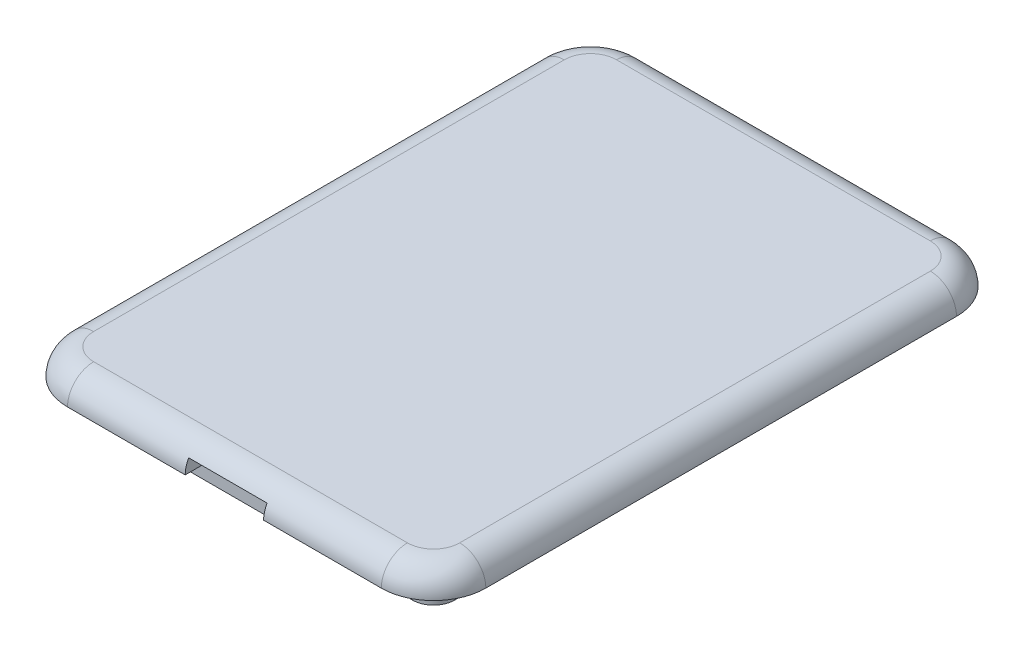
ISO-10303-21;
HEADER;
FILE_DESCRIPTION(('STEP AP214'),'2;1');
FILE_NAME('part.step','',(''),(''),'','','');
FILE_SCHEMA(('AUTOMOTIVE_DESIGN { 1 0 10303 214 1 1 1 1 }'));
ENDSEC;
DATA;
#1=APPLICATION_CONTEXT('core data for automotive mechanical design processes');
#2=APPLICATION_PROTOCOL_DEFINITION('international standard','automotive_design',2000,#1);
#3=PRODUCT_CONTEXT('',#1,'mechanical');
#4=PRODUCT('Part','Part','',(#3));
#5=PRODUCT_RELATED_PRODUCT_CATEGORY('part','',(#4));
#6=PRODUCT_DEFINITION_FORMATION('','',#4);
#7=PRODUCT_DEFINITION_CONTEXT('part definition',#1,'design');
#8=PRODUCT_DEFINITION('design','',#6,#7);
#9=PRODUCT_DEFINITION_SHAPE('','',#8);
#10=(LENGTH_UNIT() NAMED_UNIT(*) SI_UNIT(.MILLI.,.METRE.));
#11=(NAMED_UNIT(*) PLANE_ANGLE_UNIT() SI_UNIT($,.RADIAN.));
#12=(NAMED_UNIT(*) SI_UNIT($,.STERADIAN.) SOLID_ANGLE_UNIT());
#13=UNCERTAINTY_MEASURE_WITH_UNIT(LENGTH_MEASURE(1.E-05),#10,'distance_accuracy_value','');
#14=(GEOMETRIC_REPRESENTATION_CONTEXT(3) GLOBAL_UNCERTAINTY_ASSIGNED_CONTEXT((#13)) GLOBAL_UNIT_ASSIGNED_CONTEXT((#10,
#11,#12)) REPRESENTATION_CONTEXT('',''));
#15=CARTESIAN_POINT('',(0.,0.,0.));
#16=DIRECTION('',(0.,0.,1.));
#17=DIRECTION('',(1.,0.,0.));
#18=AXIS2_PLACEMENT_3D('',#15,#16,#17);
#19=CARTESIAN_POINT('',(-40.1594594594594,0.,-52.3807254623044));
#20=DIRECTION('',(0.,1.,0.));
#21=DIRECTION('',(0.,0.,1.));
#22=AXIS2_PLACEMENT_3D('',#19,#20,#21);
#23=PLANE('',#22);
#24=DIRECTION('',(1.,0.,0.));
#25=VECTOR('',#24,1.);
#26=CARTESIAN_POINT('',(0.,0.,-57.4607254623044));
#27=LINE('',#26,#25);
#28=CARTESIAN_POINT('',(-40.1594594594594,0.,-57.4607254623044));
#29=VERTEX_POINT('',#28);
#30=CARTESIAN_POINT('',(36.0405405405406,0.,-57.4607254623044));
#31=VERTEX_POINT('',#30);
#32=EDGE_CURVE('E328',#29,#31,#27,.T.);
#33=ORIENTED_EDGE('',*,*,#32,.F.);
#34=CARTESIAN_POINT('',(-40.1594594594594,0.,-52.3807254623044));
#35=DIRECTION('',(0.,1.,0.));
#36=DIRECTION('',(0.,0.,1.));
#37=AXIS2_PLACEMENT_3D('',#34,#35,#36);
#38=CIRCLE('',#37,5.07999999999999);
#39=CARTESIAN_POINT('',(-45.2394594594594,0.,-52.3807254623044));
#40=VERTEX_POINT('',#39);
#41=EDGE_CURVE('E332',#29,#40,#38,.T.);
#42=ORIENTED_EDGE('',*,*,#41,.T.);
#43=DIRECTION('',(0.,0.,1.));
#44=VECTOR('',#43,1.);
#45=CARTESIAN_POINT('',(-45.2394594594594,0.,0.));
#46=LINE('',#45,#44);
#47=CARTESIAN_POINT('',(-45.2394594594594,0.,61.9192745376956));
#48=VERTEX_POINT('',#47);
#49=EDGE_CURVE('E335',#40,#48,#46,.T.);
#50=ORIENTED_EDGE('',*,*,#49,.T.);
#51=CARTESIAN_POINT('',(-40.1594594594594,0.,61.9192745376956));
#52=DIRECTION('',(0.,1.,0.));
#53=DIRECTION('',(0.,0.,1.));
#54=AXIS2_PLACEMENT_3D('',#51,#52,#53);
#55=CIRCLE('',#54,5.07999999999999);
#56=CARTESIAN_POINT('',(-40.1594594594594,0.,66.9992745376956));
#57=VERTEX_POINT('',#56);
#58=EDGE_CURVE('E338',#48,#57,#55,.T.);
#59=ORIENTED_EDGE('',*,*,#58,.T.);
#60=DIRECTION('',(1.,0.,0.));
#61=VECTOR('',#60,1.);
#62=CARTESIAN_POINT('',(0.,0.,66.9992745376956));
#63=LINE('',#62,#61);
#64=CARTESIAN_POINT('',(36.0405405405406,0.,66.9992745376956));
#65=VERTEX_POINT('',#64);
#66=EDGE_CURVE('E341',#57,#65,#63,.T.);
#67=ORIENTED_EDGE('',*,*,#66,.T.);
#68=CARTESIAN_POINT('',(36.0405405405406,0.,61.9192745376956));
#69=DIRECTION('',(0.,1.,0.));
#70=DIRECTION('',(0.,0.,1.));
#71=AXIS2_PLACEMENT_3D('',#68,#69,#70);
#72=CIRCLE('',#71,5.08);
#73=CARTESIAN_POINT('',(41.1205405405406,0.,61.9192745376956));
#74=VERTEX_POINT('',#73);
#75=EDGE_CURVE('E344',#65,#74,#72,.T.);
#76=ORIENTED_EDGE('',*,*,#75,.T.);
#77=DIRECTION('',(0.,0.,1.));
#78=VECTOR('',#77,1.);
#79=CARTESIAN_POINT('',(41.1205405405406,0.,0.));
#80=LINE('',#79,#78);
#81=CARTESIAN_POINT('',(41.1205405405405,0.,-52.3807254623044));
#82=VERTEX_POINT('',#81);
#83=EDGE_CURVE('E347',#82,#74,#80,.T.);
#84=ORIENTED_EDGE('',*,*,#83,.F.);
#85=CARTESIAN_POINT('',(36.0405405405405,0.,-52.3807254623044));
#86=DIRECTION('',(0.,1.,0.));
#87=DIRECTION('',(0.,0.,1.));
#88=AXIS2_PLACEMENT_3D('',#85,#86,#87);
#89=CIRCLE('',#88,5.08000000000001);
#90=EDGE_CURVE('E273',#31,#82,#89,.F.);
#91=ORIENTED_EDGE('',*,*,#90,.F.);
#92=EDGE_LOOP('',(#33,#42,#50,#59,#67,#76,#84,#91));
#93=FACE_BOUND('',#92,.T.);
#94=DIRECTION('',(0.,0.,1.));
#95=VECTOR('',#94,1.);
#96=CARTESIAN_POINT('',(7.46554054054056,0.,-52.3807254623044));
#97=LINE('',#96,#95);
#98=CARTESIAN_POINT('',(7.46554054054057,0.,68.2692745376956));
#99=VERTEX_POINT('',#98);
#100=CARTESIAN_POINT('',(7.46554054054057,0.,74.6192745376956));
#101=VERTEX_POINT('',#100);
#102=EDGE_CURVE('E228',#99,#101,#97,.T.);
#103=ORIENTED_EDGE('',*,*,#102,.F.);
#104=DIRECTION('',(-1.,0.,0.));
#105=VECTOR('',#104,1.);
#106=CARTESIAN_POINT('',(-40.1594594594594,0.,68.2692745376956));
#107=LINE('',#106,#105);
#108=CARTESIAN_POINT('',(-11.5844594594594,0.,68.2692745376956));
#109=VERTEX_POINT('',#108);
#110=EDGE_CURVE('E11',#99,#109,#107,.T.);
#111=ORIENTED_EDGE('',*,*,#110,.T.);
#112=DIRECTION('',(0.,0.,1.));
#113=VECTOR('',#112,1.);
#114=CARTESIAN_POINT('',(-11.5844594594594,0.,-52.3807254623044));
#115=LINE('',#114,#113);
#116=CARTESIAN_POINT('',(-11.5844594594594,0.,74.6192745376956));
#117=VERTEX_POINT('',#116);
#118=EDGE_CURVE('E223',#109,#117,#115,.T.);
#119=ORIENTED_EDGE('',*,*,#118,.T.);
#120=DIRECTION('',(1.,0.,0.));
#121=VECTOR('',#120,1.);
#122=CARTESIAN_POINT('',(-40.1594594594594,0.,74.6192745376956));
#123=LINE('',#122,#121);
#124=CARTESIAN_POINT('',(-40.1594594594594,0.,74.6192745376956));
#125=VERTEX_POINT('',#124);
#126=EDGE_CURVE('E250',#125,#117,#123,.T.);
#127=ORIENTED_EDGE('',*,*,#126,.F.);
#128=CARTESIAN_POINT('',(-40.1594594594594,0.,61.9192745376956));
#129=DIRECTION('',(0.,1.,0.));
#130=DIRECTION('',(0.,0.,1.));
#131=AXIS2_PLACEMENT_3D('',#128,#129,#130);
#132=CIRCLE('',#131,12.7);
#133=CARTESIAN_POINT('',(-52.8594594594594,0.,61.9192745376955));
#134=VERTEX_POINT('',#133);
#135=EDGE_CURVE('E245',#134,#125,#132,.T.);
#136=ORIENTED_EDGE('',*,*,#135,.F.);
#137=DIRECTION('',(0.,0.,1.));
#138=VECTOR('',#137,1.);
#139=CARTESIAN_POINT('',(-52.8594594594594,0.,-52.3807254623043));
#140=LINE('',#139,#138);
#141=CARTESIAN_POINT('',(-52.8594594594594,0.,-52.3807254623043));
#142=VERTEX_POINT('',#141);
#143=EDGE_CURVE('E240',#142,#134,#140,.T.);
#144=ORIENTED_EDGE('',*,*,#143,.F.);
#145=CARTESIAN_POINT('',(-40.1594594594594,0.,-52.3807254623044));
#146=DIRECTION('',(0.,1.,0.));
#147=DIRECTION('',(0.,0.,1.));
#148=AXIS2_PLACEMENT_3D('',#145,#146,#147);
#149=CIRCLE('',#148,12.7);
#150=CARTESIAN_POINT('',(-40.1594594594594,0.,-65.0807254623044));
#151=VERTEX_POINT('',#150);
#152=EDGE_CURVE('E236',#151,#142,#149,.T.);
#153=ORIENTED_EDGE('',*,*,#152,.F.);
#154=DIRECTION('',(1.,0.,0.));
#155=VECTOR('',#154,1.);
#156=CARTESIAN_POINT('',(-40.1594594594594,0.,-65.0807254623044));
#157=LINE('',#156,#155);
#158=CARTESIAN_POINT('',(36.0405405405404,0.,-65.0807254623044));
#159=VERTEX_POINT('',#158);
#160=EDGE_CURVE('E264',#151,#159,#157,.T.);
#161=ORIENTED_EDGE('',*,*,#160,.T.);
#162=CARTESIAN_POINT('',(36.0405405405405,0.,-52.3807254623044));
#163=DIRECTION('',(0.,-1.,0.));
#164=DIRECTION('',(0.,0.,-1.));
#165=AXIS2_PLACEMENT_3D('',#162,#163,#164);
#166=CIRCLE('',#165,12.7);
#167=CARTESIAN_POINT('',(48.7405405405405,0.,-52.3807254623043));
#168=VERTEX_POINT('',#167);
#169=EDGE_CURVE('E261',#159,#168,#166,.T.);
#170=ORIENTED_EDGE('',*,*,#169,.T.);
#171=DIRECTION('',(0.,0.,1.));
#172=VECTOR('',#171,1.);
#173=CARTESIAN_POINT('',(48.7405405405405,0.,-52.3807254623043));
#174=LINE('',#173,#172);
#175=CARTESIAN_POINT('',(48.7405405405406,0.,61.9192745376955));
#176=VERTEX_POINT('',#175);
#177=EDGE_CURVE('E258',#168,#176,#174,.T.);
#178=ORIENTED_EDGE('',*,*,#177,.T.);
#179=CARTESIAN_POINT('',(36.0405405405406,0.,61.9192745376956));
#180=DIRECTION('',(0.,1.,0.));
#181=DIRECTION('',(0.,0.,1.));
#182=AXIS2_PLACEMENT_3D('',#179,#180,#181);
#183=CIRCLE('',#182,12.7);
#184=CARTESIAN_POINT('',(36.0405405405405,0.,74.6192745376956));
#185=VERTEX_POINT('',#184);
#186=EDGE_CURVE('E254',#185,#176,#183,.T.);
#187=ORIENTED_EDGE('',*,*,#186,.F.);
#188=EDGE_CURVE('E249',#101,#185,#123,.T.);
#189=ORIENTED_EDGE('',*,*,#188,.F.);
#190=EDGE_LOOP('',(#103,#111,#119,#127,#136,#144,#153,#161,#170,#178,#187,#189));
#191=FACE_BOUND('',#190,.T.);
#192=ADVANCED_FACE('F39',(#93,#191),#23,.F.);
#193=CARTESIAN_POINT('',(-40.1594594594594,0.,68.2692745376956));
#194=DIRECTION('',(-1.,0.,0.));
#195=DIRECTION('',(0.,0.,1.));
#196=AXIS2_PLACEMENT_3D('',#193,#194,#195);
#197=CYLINDRICAL_SURFACE('',#196,6.35);
#198=DIRECTION('',(-1.,0.,0.));
#199=VECTOR('',#198,1.);
#200=CARTESIAN_POINT('',(-40.1594594594594,3.175,73.7685358517268));
#201=LINE('',#200,#199);
#202=CARTESIAN_POINT('',(-11.5844594594594,3.175,73.7685358517268));
#203=VERTEX_POINT('',#202);
#204=CARTESIAN_POINT('',(7.46554054054056,3.175,73.7685358517268));
#205=VERTEX_POINT('',#204);
#206=EDGE_CURVE('E455',#203,#205,#201,.F.);
#207=ORIENTED_EDGE('',*,*,#206,.T.);
#208=CARTESIAN_POINT('',(7.46554054054056,0.,68.2692745376956));
#209=DIRECTION('',(-1.,0.,0.));
#210=DIRECTION('',(0.,-1.,0.));
#211=AXIS2_PLACEMENT_3D('',#208,#209,#210);
#212=CIRCLE('',#211,6.35);
#213=EDGE_CURVE('E48',#205,#101,#212,.F.);
#214=ORIENTED_EDGE('',*,*,#213,.T.);
#215=ORIENTED_EDGE('',*,*,#188,.T.);
#216=CARTESIAN_POINT('',(36.0405405405405,0.,68.2692745376956));
#217=DIRECTION('',(-1.,0.,0.));
#218=DIRECTION('',(0.,0.,1.));
#219=AXIS2_PLACEMENT_3D('',#216,#217,#218);
#220=CIRCLE('',#219,6.35);
#221=CARTESIAN_POINT('',(36.0405405405405,6.35,68.2692745376956));
#222=VERTEX_POINT('',#221);
#223=EDGE_CURVE('E446',#185,#222,#220,.T.);
#224=ORIENTED_EDGE('',*,*,#223,.T.);
#225=DIRECTION('',(1.,0.,0.));
#226=VECTOR('',#225,1.);
#227=CARTESIAN_POINT('',(36.0405405405405,6.35,68.2692745376956));
#228=LINE('',#227,#226);
#229=CARTESIAN_POINT('',(-40.1594594594594,6.35,68.2692745376956));
#230=VERTEX_POINT('',#229);
#231=EDGE_CURVE('E407',#230,#222,#228,.T.);
#232=ORIENTED_EDGE('',*,*,#231,.F.);
#233=CARTESIAN_POINT('',(-40.1594594594594,0.,68.2692745376956));
#234=DIRECTION('',(-1.,0.,0.));
#235=DIRECTION('',(0.,0.,1.));
#236=AXIS2_PLACEMENT_3D('',#233,#234,#235);
#237=CIRCLE('',#236,6.35);
#238=EDGE_CURVE('E438',#125,#230,#237,.T.);
#239=ORIENTED_EDGE('',*,*,#238,.F.);
#240=ORIENTED_EDGE('',*,*,#126,.T.);
#241=CARTESIAN_POINT('',(-11.5844594594594,0.,68.2692745376956));
#242=DIRECTION('',(-1.,0.,0.));
#243=DIRECTION('',(0.,0.,1.));
#244=AXIS2_PLACEMENT_3D('',#241,#242,#243);
#245=CIRCLE('',#244,6.35);
#246=EDGE_CURVE('E424',#203,#117,#245,.F.);
#247=ORIENTED_EDGE('',*,*,#246,.F.);
#248=EDGE_LOOP('',(#207,#214,#215,#224,#232,#239,#240,#247));
#249=FACE_BOUND('',#248,.T.);
#250=ADVANCED_FACE('F460',(#249),#197,.T.);
#251=CARTESIAN_POINT('',(0.,-6.35,-57.4607254623044));
#252=DIRECTION('',(0.,0.,1.));
#253=DIRECTION('',(1.,0.,0.));
#254=AXIS2_PLACEMENT_3D('',#251,#252,#253);
#255=PLANE('',#254);
#256=ORIENTED_EDGE('',*,*,#32,.T.);
#257=DIRECTION('',(0.,1.,0.));
#258=VECTOR('',#257,1.);
#259=CARTESIAN_POINT('',(36.0405405405406,-6.35,-57.4607254623044));
#260=LINE('',#259,#258);
#261=CARTESIAN_POINT('',(36.0405405405406,-6.35,-57.4607254623044));
#262=VERTEX_POINT('',#261);
#263=EDGE_CURVE('E354',#262,#31,#260,.T.);
#264=ORIENTED_EDGE('',*,*,#263,.F.);
#265=DIRECTION('',(1.,0.,0.));
#266=VECTOR('',#265,1.);
#267=CARTESIAN_POINT('',(0.,-6.35,-57.4607254623044));
#268=LINE('',#267,#266);
#269=CARTESIAN_POINT('',(-40.1594594594594,-6.35,-57.4607254623044));
#270=VERTEX_POINT('',#269);
#271=EDGE_CURVE('E284',#270,#262,#268,.T.);
#272=ORIENTED_EDGE('',*,*,#271,.F.);
#273=DIRECTION('',(0.,1.,0.));
#274=VECTOR('',#273,1.);
#275=CARTESIAN_POINT('',(-40.1594594594594,-6.35,-57.4607254623044));
#276=LINE('',#275,#274);
#277=EDGE_CURVE('E383',#270,#29,#276,.T.);
#278=ORIENTED_EDGE('',*,*,#277,.T.);
#279=EDGE_LOOP('',(#256,#264,#272,#278));
#280=FACE_BOUND('',#279,.T.);
#281=ADVANCED_FACE('F495',(#280),#255,.F.);
#282=CARTESIAN_POINT('',(36.0405405405405,-6.35,-52.3807254623044));
#283=DIRECTION('',(0.,1.,0.));
#284=DIRECTION('',(0.,0.,1.));
#285=AXIS2_PLACEMENT_3D('',#282,#283,#284);
#286=CYLINDRICAL_SURFACE('',#285,5.08000000000001);
#287=ORIENTED_EDGE('',*,*,#90,.T.);
#288=DIRECTION('',(0.,1.,0.));
#289=VECTOR('',#288,1.);
#290=CARTESIAN_POINT('',(41.1205405405405,-6.35,-52.3807254623044));
#291=LINE('',#290,#289);
#292=CARTESIAN_POINT('',(41.1205405405405,-6.35,-52.3807254623044));
#293=VERTEX_POINT('',#292);
#294=EDGE_CURVE('E359',#293,#82,#291,.T.);
#295=ORIENTED_EDGE('',*,*,#294,.F.);
#296=CARTESIAN_POINT('',(36.0405405405405,-6.35,-52.3807254623044));
#297=DIRECTION('',(0.,1.,0.));
#298=DIRECTION('',(0.,0.,1.));
#299=AXIS2_PLACEMENT_3D('',#296,#297,#298);
#300=CIRCLE('',#299,5.08000000000001);
#301=EDGE_CURVE('E311',#262,#293,#300,.F.);
#302=ORIENTED_EDGE('',*,*,#301,.F.);
#303=ORIENTED_EDGE('',*,*,#263,.T.);
#304=EDGE_LOOP('',(#287,#295,#302,#303));
#305=FACE_BOUND('',#304,.T.);
#306=ADVANCED_FACE('F534',(#305),#286,.T.);
#307=CARTESIAN_POINT('',(41.1205405405406,-6.35,0.));
#308=DIRECTION('',(-1.,0.,0.));
#309=DIRECTION('',(0.,0.,1.));
#310=AXIS2_PLACEMENT_3D('',#307,#308,#309);
#311=PLANE('',#310);
#312=ORIENTED_EDGE('',*,*,#83,.T.);
#313=DIRECTION('',(0.,1.,0.));
#314=VECTOR('',#313,1.);
#315=CARTESIAN_POINT('',(41.1205405405406,-6.35,61.9192745376956));
#316=LINE('',#315,#314);
#317=CARTESIAN_POINT('',(41.1205405405406,-6.35,61.9192745376956));
#318=VERTEX_POINT('',#317);
#319=EDGE_CURVE('E363',#318,#74,#316,.T.);
#320=ORIENTED_EDGE('',*,*,#319,.F.);
#321=DIRECTION('',(0.,0.,1.));
#322=VECTOR('',#321,1.);
#323=CARTESIAN_POINT('',(41.1205405405406,-6.35,0.));
#324=LINE('',#323,#322);
#325=EDGE_CURVE('E308',#293,#318,#324,.T.);
#326=ORIENTED_EDGE('',*,*,#325,.F.);
#327=ORIENTED_EDGE('',*,*,#294,.T.);
#328=EDGE_LOOP('',(#312,#320,#326,#327));
#329=FACE_BOUND('',#328,.T.);
#330=ADVANCED_FACE('F538',(#329),#311,.F.);
#331=CARTESIAN_POINT('',(36.0405405405406,-6.35,61.9192745376956));
#332=DIRECTION('',(0.,1.,0.));
#333=DIRECTION('',(0.,0.,1.));
#334=AXIS2_PLACEMENT_3D('',#331,#332,#333);
#335=CYLINDRICAL_SURFACE('',#334,5.08);
#336=ORIENTED_EDGE('',*,*,#75,.F.);
#337=DIRECTION('',(0.,1.,0.));
#338=VECTOR('',#337,1.);
#339=CARTESIAN_POINT('',(36.0405405405406,-6.35,66.9992745376956));
#340=LINE('',#339,#338);
#341=CARTESIAN_POINT('',(36.0405405405406,-6.35,66.9992745376956));
#342=VERTEX_POINT('',#341);
#343=EDGE_CURVE('E367',#342,#65,#340,.T.);
#344=ORIENTED_EDGE('',*,*,#343,.F.);
#345=CARTESIAN_POINT('',(36.0405405405406,-6.35,61.9192745376956));
#346=DIRECTION('',(0.,1.,0.));
#347=DIRECTION('',(0.,0.,1.));
#348=AXIS2_PLACEMENT_3D('',#345,#346,#347);
#349=CIRCLE('',#348,5.08);
#350=EDGE_CURVE('E304',#342,#318,#349,.T.);
#351=ORIENTED_EDGE('',*,*,#350,.T.);
#352=ORIENTED_EDGE('',*,*,#319,.T.);
#353=EDGE_LOOP('',(#336,#344,#351,#352));
#354=FACE_BOUND('',#353,.T.);
#355=ADVANCED_FACE('F555',(#354),#335,.T.);
#356=CARTESIAN_POINT('',(0.,-6.35,66.9992745376956));
#357=DIRECTION('',(0.,0.,1.));
#358=DIRECTION('',(1.,0.,0.));
#359=AXIS2_PLACEMENT_3D('',#356,#357,#358);
#360=PLANE('',#359);
#361=ORIENTED_EDGE('',*,*,#66,.F.);
#362=DIRECTION('',(0.,1.,0.));
#363=VECTOR('',#362,1.);
#364=CARTESIAN_POINT('',(-40.1594594594594,-6.35,66.9992745376956));
#365=LINE('',#364,#363);
#366=CARTESIAN_POINT('',(-40.1594594594594,-6.35,66.9992745376956));
#367=VERTEX_POINT('',#366);
#368=EDGE_CURVE('E371',#367,#57,#365,.T.);
#369=ORIENTED_EDGE('',*,*,#368,.F.);
#370=DIRECTION('',(1.,0.,0.));
#371=VECTOR('',#370,1.);
#372=CARTESIAN_POINT('',(0.,-6.35,66.9992745376956));
#373=LINE('',#372,#371);
#374=EDGE_CURVE('E300',#367,#342,#373,.T.);
#375=ORIENTED_EDGE('',*,*,#374,.T.);
#376=ORIENTED_EDGE('',*,*,#343,.T.);
#377=EDGE_LOOP('',(#361,#369,#375,#376));
#378=FACE_BOUND('',#377,.T.);
#379=ADVANCED_FACE('F545',(#378),#360,.T.);
#380=CARTESIAN_POINT('',(-40.1594594594594,-6.35,61.9192745376956));
#381=DIRECTION('',(0.,1.,0.));
#382=DIRECTION('',(0.,0.,1.));
#383=AXIS2_PLACEMENT_3D('',#380,#381,#382);
#384=CYLINDRICAL_SURFACE('',#383,5.07999999999999);
#385=ORIENTED_EDGE('',*,*,#58,.F.);
#386=DIRECTION('',(0.,1.,0.));
#387=VECTOR('',#386,1.);
#388=CARTESIAN_POINT('',(-45.2394594594594,-6.35,61.9192745376956));
#389=LINE('',#388,#387);
#390=CARTESIAN_POINT('',(-45.2394594594594,-6.35,61.9192745376956));
#391=VERTEX_POINT('',#390);
#392=EDGE_CURVE('E375',#391,#48,#389,.T.);
#393=ORIENTED_EDGE('',*,*,#392,.F.);
#394=CARTESIAN_POINT('',(-40.1594594594594,-6.35,61.9192745376956));
#395=DIRECTION('',(0.,1.,0.));
#396=DIRECTION('',(0.,0.,1.));
#397=AXIS2_PLACEMENT_3D('',#394,#395,#396);
#398=CIRCLE('',#397,5.07999999999999);
#399=EDGE_CURVE('E296',#391,#367,#398,.T.);
#400=ORIENTED_EDGE('',*,*,#399,.T.);
#401=ORIENTED_EDGE('',*,*,#368,.T.);
#402=EDGE_LOOP('',(#385,#393,#400,#401));
#403=FACE_BOUND('',#402,.T.);
#404=ADVANCED_FACE('F549',(#403),#384,.T.);
#405=CARTESIAN_POINT('',(-45.2394594594594,-6.35,0.));
#406=DIRECTION('',(-1.,0.,0.));
#407=DIRECTION('',(0.,0.,1.));
#408=AXIS2_PLACEMENT_3D('',#405,#406,#407);
#409=PLANE('',#408);
#410=ORIENTED_EDGE('',*,*,#49,.F.);
#411=DIRECTION('',(0.,1.,0.));
#412=VECTOR('',#411,1.);
#413=CARTESIAN_POINT('',(-45.2394594594594,-6.35,-52.3807254623044));
#414=LINE('',#413,#412);
#415=CARTESIAN_POINT('',(-45.2394594594594,-6.35,-52.3807254623044));
#416=VERTEX_POINT('',#415);
#417=EDGE_CURVE('E379',#416,#40,#414,.T.);
#418=ORIENTED_EDGE('',*,*,#417,.F.);
#419=DIRECTION('',(0.,0.,1.));
#420=VECTOR('',#419,1.);
#421=CARTESIAN_POINT('',(-45.2394594594594,-6.35,0.));
#422=LINE('',#421,#420);
#423=EDGE_CURVE('E292',#416,#391,#422,.T.);
#424=ORIENTED_EDGE('',*,*,#423,.T.);
#425=ORIENTED_EDGE('',*,*,#392,.T.);
#426=EDGE_LOOP('',(#410,#418,#424,#425));
#427=FACE_BOUND('',#426,.T.);
#428=ADVANCED_FACE('F552',(#427),#409,.T.);
#429=CARTESIAN_POINT('',(-37.6194594594594,-6.35,0.));
#430=DIRECTION('',(-1.,0.,0.));
#431=DIRECTION('',(0.,0.,1.));
#432=AXIS2_PLACEMENT_3D('',#429,#430,#431);
#433=PLANE('',#432);
#434=DIRECTION('',(0.,0.,1.));
#435=VECTOR('',#434,1.);
#436=CARTESIAN_POINT('',(-37.6194594594594,0.,0.));
#437=LINE('',#436,#435);
#438=CARTESIAN_POINT('',(-37.6194594594594,0.,-49.8407254623044));
#439=VERTEX_POINT('',#438);
#440=CARTESIAN_POINT('',(-37.6194594594594,0.,59.3792745376956));
#441=VERTEX_POINT('',#440);
#442=EDGE_CURVE('E267',#439,#441,#437,.T.);
#443=ORIENTED_EDGE('',*,*,#442,.T.);
#444=DIRECTION('',(0.,1.,0.));
#445=VECTOR('',#444,1.);
#446=CARTESIAN_POINT('',(-37.6194594594594,-6.35,59.3792745376956));
#447=LINE('',#446,#445);
#448=CARTESIAN_POINT('',(-37.6194594594594,-6.35,59.3792745376956));
#449=VERTEX_POINT('',#448);
#450=EDGE_CURVE('E387',#449,#441,#447,.T.);
#451=ORIENTED_EDGE('',*,*,#450,.F.);
#452=DIRECTION('',(0.,0.,1.));
#453=VECTOR('',#452,1.);
#454=CARTESIAN_POINT('',(-37.6194594594594,-6.35,0.));
#455=LINE('',#454,#453);
#456=CARTESIAN_POINT('',(-37.6194594594594,-6.35,-49.8407254623044));
#457=VERTEX_POINT('',#456);
#458=EDGE_CURVE('E268',#457,#449,#455,.T.);
#459=ORIENTED_EDGE('',*,*,#458,.F.);
#460=DIRECTION('',(0.,1.,0.));
#461=VECTOR('',#460,1.);
#462=CARTESIAN_POINT('',(-37.6194594594594,-6.35,-49.8407254623044));
#463=LINE('',#462,#461);
#464=EDGE_CURVE('E314',#457,#439,#463,.T.);
#465=ORIENTED_EDGE('',*,*,#464,.T.);
#466=EDGE_LOOP('',(#443,#451,#459,#465));
#467=FACE_BOUND('',#466,.T.);
#468=ADVANCED_FACE('F512',(#467),#433,.F.);
#469=CARTESIAN_POINT('',(0.,-6.35,59.3792745376956));
#470=DIRECTION('',(0.,0.,1.));
#471=DIRECTION('',(1.,0.,0.));
#472=AXIS2_PLACEMENT_3D('',#469,#470,#471);
#473=PLANE('',#472);
#474=DIRECTION('',(1.,0.,0.));
#475=VECTOR('',#474,1.);
#476=CARTESIAN_POINT('',(0.,0.,59.3792745376956));
#477=LINE('',#476,#475);
#478=CARTESIAN_POINT('',(33.5005405405405,0.,59.3792745376956));
#479=VERTEX_POINT('',#478);
#480=EDGE_CURVE('E324',#441,#479,#477,.T.);
#481=ORIENTED_EDGE('',*,*,#480,.T.);
#482=DIRECTION('',(0.,1.,0.));
#483=VECTOR('',#482,1.);
#484=CARTESIAN_POINT('',(33.5005405405405,-6.35,59.3792745376956));
#485=LINE('',#484,#483);
#486=CARTESIAN_POINT('',(33.5005405405405,-6.35,59.3792745376956));
#487=VERTEX_POINT('',#486);
#488=EDGE_CURVE('E391',#487,#479,#485,.T.);
#489=ORIENTED_EDGE('',*,*,#488,.F.);
#490=DIRECTION('',(1.,0.,0.));
#491=VECTOR('',#490,1.);
#492=CARTESIAN_POINT('',(0.,-6.35,59.3792745376956));
#493=LINE('',#492,#491);
#494=EDGE_CURVE('E281',#449,#487,#493,.T.);
#495=ORIENTED_EDGE('',*,*,#494,.F.);
#496=ORIENTED_EDGE('',*,*,#450,.T.);
#497=EDGE_LOOP('',(#481,#489,#495,#496));
#498=FACE_BOUND('',#497,.T.);
#499=ADVANCED_FACE('F522',(#498),#473,.F.);
#500=CARTESIAN_POINT('',(33.5005405405405,-6.35,0.));
#501=DIRECTION('',(-1.,0.,0.));
#502=DIRECTION('',(0.,0.,1.));
#503=AXIS2_PLACEMENT_3D('',#500,#501,#502);
#504=PLANE('',#503);
#505=DIRECTION('',(0.,0.,1.));
#506=VECTOR('',#505,1.);
#507=CARTESIAN_POINT('',(33.5005405405405,0.,0.));
#508=LINE('',#507,#506);
#509=CARTESIAN_POINT('',(33.5005405405405,0.,-49.8407254623044));
#510=VERTEX_POINT('',#509);
#511=EDGE_CURVE('E321',#510,#479,#508,.T.);
#512=ORIENTED_EDGE('',*,*,#511,.F.);
#513=DIRECTION('',(0.,1.,0.));
#514=VECTOR('',#513,1.);
#515=CARTESIAN_POINT('',(33.5005405405405,-6.35,-49.8407254623044));
#516=LINE('',#515,#514);
#517=CARTESIAN_POINT('',(33.5005405405405,-6.35,-49.8407254623044));
#518=VERTEX_POINT('',#517);
#519=EDGE_CURVE('E395',#518,#510,#516,.T.);
#520=ORIENTED_EDGE('',*,*,#519,.F.);
#521=DIRECTION('',(0.,0.,1.));
#522=VECTOR('',#521,1.);
#523=CARTESIAN_POINT('',(33.5005405405405,-6.35,0.));
#524=LINE('',#523,#522);
#525=EDGE_CURVE('E277',#518,#487,#524,.T.);
#526=ORIENTED_EDGE('',*,*,#525,.T.);
#527=ORIENTED_EDGE('',*,*,#488,.T.);
#528=EDGE_LOOP('',(#512,#520,#526,#527));
#529=FACE_BOUND('',#528,.T.);
#530=ADVANCED_FACE('F519',(#529),#504,.T.);
#531=CARTESIAN_POINT('',(0.,-6.35,-49.8407254623044));
#532=DIRECTION('',(0.,0.,1.));
#533=DIRECTION('',(1.,0.,0.));
#534=AXIS2_PLACEMENT_3D('',#531,#532,#533);
#535=PLANE('',#534);
#536=DIRECTION('',(1.,0.,0.));
#537=VECTOR('',#536,1.);
#538=CARTESIAN_POINT('',(0.,0.,-49.8407254623044));
#539=LINE('',#538,#537);
#540=EDGE_CURVE('E318',#439,#510,#539,.T.);
#541=ORIENTED_EDGE('',*,*,#540,.F.);
#542=ORIENTED_EDGE('',*,*,#464,.F.);
#543=DIRECTION('',(1.,0.,0.));
#544=VECTOR('',#543,1.);
#545=CARTESIAN_POINT('',(0.,-6.35,-49.8407254623044));
#546=LINE('',#545,#544);
#547=EDGE_CURVE('E272',#457,#518,#546,.T.);
#548=ORIENTED_EDGE('',*,*,#547,.T.);
#549=ORIENTED_EDGE('',*,*,#519,.T.);
#550=EDGE_LOOP('',(#541,#542,#548,#549));
#551=FACE_BOUND('',#550,.T.);
#552=ADVANCED_FACE('F515',(#551),#535,.T.);
#553=CARTESIAN_POINT('',(-40.1594594594594,-6.35,-52.3807254623044));
#554=DIRECTION('',(0.,1.,0.));
#555=DIRECTION('',(0.,0.,1.));
#556=AXIS2_PLACEMENT_3D('',#553,#554,#555);
#557=CYLINDRICAL_SURFACE('',#556,5.07999999999999);
#558=ORIENTED_EDGE('',*,*,#41,.F.);
#559=ORIENTED_EDGE('',*,*,#277,.F.);
#560=CARTESIAN_POINT('',(-40.1594594594594,-6.35,-52.3807254623044));
#561=DIRECTION('',(0.,1.,0.));
#562=DIRECTION('',(0.,0.,1.));
#563=AXIS2_PLACEMENT_3D('',#560,#561,#562);
#564=CIRCLE('',#563,5.07999999999999);
#565=EDGE_CURVE('E288',#270,#416,#564,.T.);
#566=ORIENTED_EDGE('',*,*,#565,.T.);
#567=ORIENTED_EDGE('',*,*,#417,.T.);
#568=EDGE_LOOP('',(#558,#559,#566,#567));
#569=FACE_BOUND('',#568,.T.);
#570=ADVANCED_FACE('F526',(#569),#557,.T.);
#571=CARTESIAN_POINT('',(0.,-6.35,0.));
#572=DIRECTION('',(0.,1.,0.));
#573=DIRECTION('',(0.,0.,1.));
#574=AXIS2_PLACEMENT_3D('',#571,#572,#573);
#575=PLANE('',#574);
#576=ORIENTED_EDGE('',*,*,#458,.T.);
#577=ORIENTED_EDGE('',*,*,#494,.T.);
#578=ORIENTED_EDGE('',*,*,#525,.F.);
#579=ORIENTED_EDGE('',*,*,#547,.F.);
#580=EDGE_LOOP('',(#576,#577,#578,#579));
#581=FACE_BOUND('',#580,.T.);
#582=ORIENTED_EDGE('',*,*,#271,.T.);
#583=ORIENTED_EDGE('',*,*,#301,.T.);
#584=ORIENTED_EDGE('',*,*,#325,.T.);
#585=ORIENTED_EDGE('',*,*,#350,.F.);
#586=ORIENTED_EDGE('',*,*,#374,.F.);
#587=ORIENTED_EDGE('',*,*,#399,.F.);
#588=ORIENTED_EDGE('',*,*,#423,.F.);
#589=ORIENTED_EDGE('',*,*,#565,.F.);
#590=EDGE_LOOP('',(#582,#583,#584,#585,#586,#587,#588,#589));
#591=FACE_BOUND('',#590,.T.);
#592=ADVANCED_FACE('F507',(#581,#591),#575,.F.);
#593=CARTESIAN_POINT('',(-40.1594594594594,6.35,-52.3807254623044));
#594=DIRECTION('',(0.,1.,0.));
#595=DIRECTION('',(0.,0.,1.));
#596=AXIS2_PLACEMENT_3D('',#593,#594,#595);
#597=PLANE('',#596);
#598=DIRECTION('',(1.,0.,0.));
#599=VECTOR('',#598,1.);
#600=CARTESIAN_POINT('',(-40.1594594594594,6.35,-58.7307254623044));
#601=LINE('',#600,#599);
#602=CARTESIAN_POINT('',(36.0405405405404,6.35,-58.7307254623044));
#603=VERTEX_POINT('',#602);
#604=CARTESIAN_POINT('',(-40.1594594594594,6.35,-58.7307254623044));
#605=VERTEX_POINT('',#604);
#606=EDGE_CURVE('E63',#603,#605,#601,.F.);
#607=ORIENTED_EDGE('',*,*,#606,.T.);
#608=CARTESIAN_POINT('',(-40.1594594594594,6.35,-52.3807254623044));
#609=DIRECTION('',(0.,1.,0.));
#610=DIRECTION('',(0.,0.,1.));
#611=AXIS2_PLACEMENT_3D('',#608,#609,#610);
#612=CIRCLE('',#611,6.35);
#613=CARTESIAN_POINT('',(-46.5094594594594,6.35,-52.3807254623044));
#614=VERTEX_POINT('',#613);
#615=EDGE_CURVE('E421',#605,#614,#612,.T.);
#616=ORIENTED_EDGE('',*,*,#615,.T.);
#617=DIRECTION('',(0.,0.,1.));
#618=VECTOR('',#617,1.);
#619=CARTESIAN_POINT('',(-46.5094594594594,6.35,61.9192745376955));
#620=LINE('',#619,#618);
#621=CARTESIAN_POINT('',(-46.5094594594594,6.35,61.9192745376956));
#622=VERTEX_POINT('',#621);
#623=EDGE_CURVE('E358',#614,#622,#620,.T.);
#624=ORIENTED_EDGE('',*,*,#623,.T.);
#625=CARTESIAN_POINT('',(-40.1594594594594,6.35,61.9192745376956));
#626=DIRECTION('',(0.,1.,0.));
#627=DIRECTION('',(0.,0.,1.));
#628=AXIS2_PLACEMENT_3D('',#625,#626,#627);
#629=CIRCLE('',#628,6.35);
#630=EDGE_CURVE('E404',#622,#230,#629,.T.);
#631=ORIENTED_EDGE('',*,*,#630,.T.);
#632=ORIENTED_EDGE('',*,*,#231,.T.);
#633=CARTESIAN_POINT('',(36.0405405405406,6.35,61.9192745376956));
#634=DIRECTION('',(0.,1.,0.));
#635=DIRECTION('',(0.,0.,1.));
#636=AXIS2_PLACEMENT_3D('',#633,#634,#635);
#637=CIRCLE('',#636,6.35);
#638=CARTESIAN_POINT('',(42.3905405405405,6.35,61.9192745376955));
#639=VERTEX_POINT('',#638);
#640=EDGE_CURVE('E410',#222,#639,#637,.T.);
#641=ORIENTED_EDGE('',*,*,#640,.T.);
#642=DIRECTION('',(0.,0.,1.));
#643=VECTOR('',#642,1.);
#644=CARTESIAN_POINT('',(42.3905405405405,6.35,-52.3807254623044));
#645=LINE('',#644,#643);
#646=CARTESIAN_POINT('',(42.3905405405405,6.35,-52.3807254623044));
#647=VERTEX_POINT('',#646);
#648=EDGE_CURVE('E413',#639,#647,#645,.F.);
#649=ORIENTED_EDGE('',*,*,#648,.T.);
#650=CARTESIAN_POINT('',(36.0405405405405,6.35,-52.3807254623044));
#651=DIRECTION('',(0.,1.,0.));
#652=DIRECTION('',(0.,0.,1.));
#653=AXIS2_PLACEMENT_3D('',#650,#651,#652);
#654=CIRCLE('',#653,6.35);
#655=EDGE_CURVE('E416',#647,#603,#654,.T.);
#656=ORIENTED_EDGE('',*,*,#655,.T.);
#657=EDGE_LOOP('',(#607,#616,#624,#631,#632,#641,#649,#656));
#658=FACE_BOUND('',#657,.T.);
#659=ADVANCED_FACE('F500',(#658),#597,.T.);
#660=ORIENTED_EDGE('',*,*,#442,.F.);
#661=ORIENTED_EDGE('',*,*,#540,.T.);
#662=ORIENTED_EDGE('',*,*,#511,.T.);
#663=ORIENTED_EDGE('',*,*,#480,.F.);
#664=EDGE_LOOP('',(#660,#661,#662,#663));
#665=FACE_BOUND('',#664,.T.);
#666=ADVANCED_FACE('F491',(#665),#23,.F.);
#667=CARTESIAN_POINT('',(36.0405405405406,0.,61.9192745376956));
#668=DIRECTION('',(0.,1.,0.));
#669=DIRECTION('',(0.,0.,1.));
#670=AXIS2_PLACEMENT_3D('',#667,#668,#669);
#671=DEGENERATE_TOROIDAL_SURFACE('',#670,6.35,6.35,.T.);
#672=ORIENTED_EDGE('',*,*,#223,.F.);
#673=ORIENTED_EDGE('',*,*,#186,.T.);
#674=CARTESIAN_POINT('',(42.3905405405405,0.,61.9192745376955));
#675=DIRECTION('',(0.,0.,-1.));
#676=DIRECTION('',(-1.,0.,0.));
#677=AXIS2_PLACEMENT_3D('',#674,#675,#676);
#678=CIRCLE('',#677,6.35);
#679=EDGE_CURVE('E241',#639,#176,#678,.T.);
#680=ORIENTED_EDGE('',*,*,#679,.F.);
#681=ORIENTED_EDGE('',*,*,#640,.F.);
#682=EDGE_LOOP('',(#672,#673,#680,#681));
#683=FACE_BOUND('',#682,.T.);
#684=ADVANCED_FACE('F41',(#683),#671,.T.);
#685=CARTESIAN_POINT('',(42.3905405405405,0.,-52.3807254623043));
#686=DIRECTION('',(0.,0.,1.));
#687=DIRECTION('',(1.,0.,0.));
#688=AXIS2_PLACEMENT_3D('',#685,#686,#687);
#689=CYLINDRICAL_SURFACE('',#688,6.35);
#690=ORIENTED_EDGE('',*,*,#679,.T.);
#691=ORIENTED_EDGE('',*,*,#177,.F.);
#692=CARTESIAN_POINT('',(42.3905405405405,0.,-52.3807254623044));
#693=DIRECTION('',(0.,0.,-1.));
#694=DIRECTION('',(-1.,0.,0.));
#695=AXIS2_PLACEMENT_3D('',#692,#693,#694);
#696=CIRCLE('',#695,6.35);
#697=EDGE_CURVE('E442',#647,#168,#696,.T.);
#698=ORIENTED_EDGE('',*,*,#697,.F.);
#699=ORIENTED_EDGE('',*,*,#648,.F.);
#700=EDGE_LOOP('',(#690,#691,#698,#699));
#701=FACE_BOUND('',#700,.T.);
#702=ADVANCED_FACE('F506',(#701),#689,.T.);
#703=CARTESIAN_POINT('',(36.0405405405405,0.,-52.3807254623044));
#704=DIRECTION('',(0.,1.,0.));
#705=DIRECTION('',(0.,0.,1.));
#706=AXIS2_PLACEMENT_3D('',#703,#704,#705);
#707=DEGENERATE_TOROIDAL_SURFACE('',#706,6.35,6.35,.T.);
#708=ORIENTED_EDGE('',*,*,#697,.T.);
#709=ORIENTED_EDGE('',*,*,#169,.F.);
#710=CARTESIAN_POINT('',(36.0405405405404,0.,-58.7307254623044));
#711=DIRECTION('',(-1.,0.,0.));
#712=DIRECTION('',(0.,0.,1.));
#713=AXIS2_PLACEMENT_3D('',#710,#711,#712);
#714=CIRCLE('',#713,6.35);
#715=EDGE_CURVE('E434',#603,#159,#714,.T.);
#716=ORIENTED_EDGE('',*,*,#715,.F.);
#717=ORIENTED_EDGE('',*,*,#655,.F.);
#718=EDGE_LOOP('',(#708,#709,#716,#717));
#719=FACE_BOUND('',#718,.T.);
#720=ADVANCED_FACE('F596',(#719),#707,.T.);
#721=CARTESIAN_POINT('',(-40.1594594594594,0.,61.9192745376956));
#722=DIRECTION('',(0.,1.,0.));
#723=DIRECTION('',(0.,0.,1.));
#724=AXIS2_PLACEMENT_3D('',#721,#722,#723);
#725=DEGENERATE_TOROIDAL_SURFACE('',#724,6.35,6.35,.T.);
#726=ORIENTED_EDGE('',*,*,#238,.T.);
#727=ORIENTED_EDGE('',*,*,#630,.F.);
#728=CARTESIAN_POINT('',(-46.5094594594594,0.,61.9192745376956));
#729=DIRECTION('',(0.,0.,-1.));
#730=DIRECTION('',(-1.,0.,0.));
#731=AXIS2_PLACEMENT_3D('',#728,#729,#730);
#732=CIRCLE('',#731,6.35);
#733=EDGE_CURVE('E430',#134,#622,#732,.T.);
#734=ORIENTED_EDGE('',*,*,#733,.F.);
#735=ORIENTED_EDGE('',*,*,#135,.T.);
#736=EDGE_LOOP('',(#726,#727,#734,#735));
#737=FACE_BOUND('',#736,.T.);
#738=ADVANCED_FACE('F474',(#737),#725,.T.);
#739=CARTESIAN_POINT('',(-40.1594594594594,0.,-58.7307254623044));
#740=DIRECTION('',(1.,0.,0.));
#741=DIRECTION('',(0.,0.,-1.));
#742=AXIS2_PLACEMENT_3D('',#739,#740,#741);
#743=CYLINDRICAL_SURFACE('',#742,6.35);
#744=ORIENTED_EDGE('',*,*,#715,.T.);
#745=ORIENTED_EDGE('',*,*,#160,.F.);
#746=CARTESIAN_POINT('',(-40.1594594594594,0.,-58.7307254623044));
#747=DIRECTION('',(-1.,0.,0.));
#748=DIRECTION('',(0.,0.,1.));
#749=AXIS2_PLACEMENT_3D('',#746,#747,#748);
#750=CIRCLE('',#749,6.35);
#751=EDGE_CURVE('E427',#605,#151,#750,.T.);
#752=ORIENTED_EDGE('',*,*,#751,.F.);
#753=ORIENTED_EDGE('',*,*,#606,.F.);
#754=EDGE_LOOP('',(#744,#745,#752,#753));
#755=FACE_BOUND('',#754,.T.);
#756=ADVANCED_FACE('F589',(#755),#743,.T.);
#757=CARTESIAN_POINT('',(-46.5094594594594,0.,-52.3807254623044));
#758=DIRECTION('',(0.,0.,-1.));
#759=DIRECTION('',(-1.,0.,0.));
#760=AXIS2_PLACEMENT_3D('',#757,#758,#759);
#761=CYLINDRICAL_SURFACE('',#760,6.35);
#762=ORIENTED_EDGE('',*,*,#733,.T.);
#763=ORIENTED_EDGE('',*,*,#623,.F.);
#764=CARTESIAN_POINT('',(-46.5094594594594,0.,-52.3807254623043));
#765=DIRECTION('',(0.,0.,-1.));
#766=DIRECTION('',(0.,1.,0.));
#767=AXIS2_PLACEMENT_3D('',#764,#765,#766);
#768=CIRCLE('',#767,6.35);
#769=EDGE_CURVE('E235',#142,#614,#768,.T.);
#770=ORIENTED_EDGE('',*,*,#769,.F.);
#771=ORIENTED_EDGE('',*,*,#143,.T.);
#772=EDGE_LOOP('',(#762,#763,#770,#771));
#773=FACE_BOUND('',#772,.T.);
#774=ADVANCED_FACE('F585',(#773),#761,.T.);
#775=CARTESIAN_POINT('',(-40.1594594594594,0.,-52.3807254623044));
#776=DIRECTION('',(0.,1.,0.));
#777=DIRECTION('',(0.,0.,1.));
#778=AXIS2_PLACEMENT_3D('',#775,#776,#777);
#779=DEGENERATE_TOROIDAL_SURFACE('',#778,6.35,6.35,.T.);
#780=ORIENTED_EDGE('',*,*,#751,.T.);
#781=ORIENTED_EDGE('',*,*,#152,.T.);
#782=ORIENTED_EDGE('',*,*,#769,.T.);
#783=ORIENTED_EDGE('',*,*,#615,.F.);
#784=EDGE_LOOP('',(#780,#781,#782,#783));
#785=FACE_BOUND('',#784,.T.);
#786=ADVANCED_FACE('F582',(#785),#779,.T.);
#787=CARTESIAN_POINT('',(0.,0.,68.2692745376956));
#788=DIRECTION('',(0.,0.,-1.));
#789=DIRECTION('',(-1.,0.,0.));
#790=AXIS2_PLACEMENT_3D('',#787,#788,#789);
#791=PLANE('',#790);
#792=DIRECTION('',(0.,-1.,0.));
#793=VECTOR('',#792,1.);
#794=CARTESIAN_POINT('',(7.46554054054056,3.175,68.2692745376956));
#795=LINE('',#794,#793);
#796=CARTESIAN_POINT('',(7.46554054054056,3.175,68.2692745376956));
#797=VERTEX_POINT('',#796);
#798=EDGE_CURVE('E202',#797,#99,#795,.T.);
#799=ORIENTED_EDGE('',*,*,#798,.F.);
#800=DIRECTION('',(1.,0.,0.));
#801=VECTOR('',#800,1.);
#802=CARTESIAN_POINT('',(-11.5844594594594,3.175,68.2692745376956));
#803=LINE('',#802,#801);
#804=CARTESIAN_POINT('',(-11.5844594594594,3.175,68.2692745376956));
#805=VERTEX_POINT('',#804);
#806=EDGE_CURVE('E206',#805,#797,#803,.T.);
#807=ORIENTED_EDGE('',*,*,#806,.F.);
#808=DIRECTION('',(0.,-1.,0.));
#809=VECTOR('',#808,1.);
#810=CARTESIAN_POINT('',(-11.5844594594594,3.175,68.2692745376956));
#811=LINE('',#810,#809);
#812=EDGE_CURVE('E211',#805,#109,#811,.T.);
#813=ORIENTED_EDGE('',*,*,#812,.T.);
#814=ORIENTED_EDGE('',*,*,#110,.F.);
#815=EDGE_LOOP('',(#799,#807,#813,#814));
#816=FACE_BOUND('',#815,.T.);
#817=ADVANCED_FACE('F204',(#816),#791,.F.);
#818=CARTESIAN_POINT('',(7.46554054054056,3.175,68.2692745376956));
#819=DIRECTION('',(-1.,0.,0.));
#820=DIRECTION('',(0.,-1.,0.));
#821=AXIS2_PLACEMENT_3D('',#818,#819,#820);
#822=PLANE('',#821);
#823=ORIENTED_EDGE('',*,*,#102,.T.);
#824=ORIENTED_EDGE('',*,*,#213,.F.);
#825=DIRECTION('',(0.,0.,1.));
#826=VECTOR('',#825,1.);
#827=CARTESIAN_POINT('',(7.46554054054056,3.175,68.2692745376956));
#828=LINE('',#827,#826);
#829=EDGE_CURVE('E216',#797,#205,#828,.T.);
#830=ORIENTED_EDGE('',*,*,#829,.F.);
#831=ORIENTED_EDGE('',*,*,#798,.T.);
#832=EDGE_LOOP('',(#823,#824,#830,#831));
#833=FACE_BOUND('',#832,.T.);
#834=ADVANCED_FACE('F220',(#833),#822,.T.);
#835=CARTESIAN_POINT('',(-11.5844594594594,3.175,68.2692745376956));
#836=DIRECTION('',(-1.,0.,0.));
#837=DIRECTION('',(0.,0.,1.));
#838=AXIS2_PLACEMENT_3D('',#835,#836,#837);
#839=PLANE('',#838);
#840=ORIENTED_EDGE('',*,*,#812,.F.);
#841=DIRECTION('',(0.,0.,1.));
#842=VECTOR('',#841,1.);
#843=CARTESIAN_POINT('',(-11.5844594594594,3.175,68.2692745376956));
#844=LINE('',#843,#842);
#845=EDGE_CURVE('E55',#805,#203,#844,.T.);
#846=ORIENTED_EDGE('',*,*,#845,.T.);
#847=ORIENTED_EDGE('',*,*,#246,.T.);
#848=ORIENTED_EDGE('',*,*,#118,.F.);
#849=EDGE_LOOP('',(#840,#846,#847,#848));
#850=FACE_BOUND('',#849,.T.);
#851=ADVANCED_FACE('F477',(#850),#839,.F.);
#852=CARTESIAN_POINT('',(-11.5844594594594,3.175,68.2692745376956));
#853=DIRECTION('',(0.,-1.,0.));
#854=DIRECTION('',(0.,0.,-1.));
#855=AXIS2_PLACEMENT_3D('',#852,#853,#854);
#856=PLANE('',#855);
#857=ORIENTED_EDGE('',*,*,#845,.F.);
#858=ORIENTED_EDGE('',*,*,#806,.T.);
#859=ORIENTED_EDGE('',*,*,#829,.T.);
#860=ORIENTED_EDGE('',*,*,#206,.F.);
#861=EDGE_LOOP('',(#857,#858,#859,#860));
#862=FACE_BOUND('',#861,.T.);
#863=ADVANCED_FACE('F215',(#862),#856,.T.);
#864=CLOSED_SHELL('',(#192,#250,#281,#306,#330,#355,#379,#404,#428,#468,#499,#530,#552,#570,
#592,#659,#666,#684,#702,#720,#738,#756,#774,#786,#817,#834,#851,#863));
#865=MANIFOLD_SOLID_BREP('B2',#864);
#866=ADVANCED_BREP_SHAPE_REPRESENTATION('',(#18,#865),#14);
#867=SHAPE_DEFINITION_REPRESENTATION(#9,#866);
ENDSEC;
END-ISO-10303-21;
